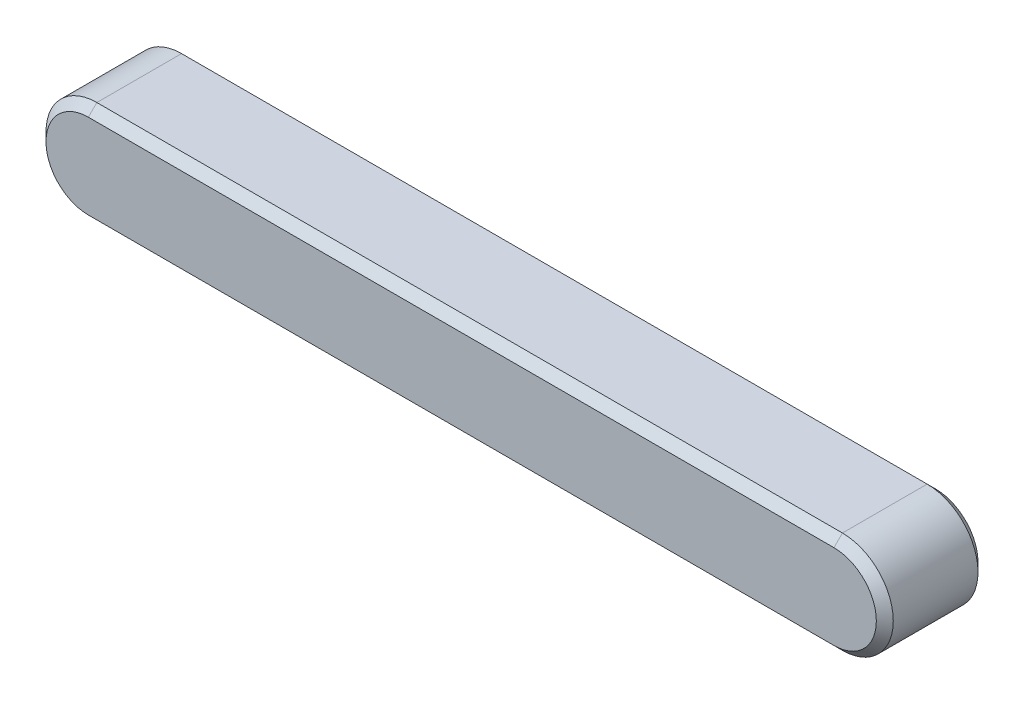
ISO-10303-21;
HEADER;
FILE_DESCRIPTION(('STEP AP214'),'2;1');
FILE_NAME('part.step','',(''),(''),'','','');
FILE_SCHEMA(('AUTOMOTIVE_DESIGN { 1 0 10303 214 1 1 1 1 }'));
ENDSEC;
DATA;
#1=APPLICATION_CONTEXT('core data for automotive mechanical design processes');
#2=APPLICATION_PROTOCOL_DEFINITION('international standard','automotive_design',2000,#1);
#3=PRODUCT_CONTEXT('',#1,'mechanical');
#4=PRODUCT('Part','Part','',(#3));
#5=PRODUCT_RELATED_PRODUCT_CATEGORY('part','',(#4));
#6=PRODUCT_DEFINITION_FORMATION('','',#4);
#7=PRODUCT_DEFINITION_CONTEXT('part definition',#1,'design');
#8=PRODUCT_DEFINITION('design','',#6,#7);
#9=PRODUCT_DEFINITION_SHAPE('','',#8);
#10=(LENGTH_UNIT() NAMED_UNIT(*) SI_UNIT(.MILLI.,.METRE.));
#11=(NAMED_UNIT(*) PLANE_ANGLE_UNIT() SI_UNIT($,.RADIAN.));
#12=(NAMED_UNIT(*) SI_UNIT($,.STERADIAN.) SOLID_ANGLE_UNIT());
#13=UNCERTAINTY_MEASURE_WITH_UNIT(LENGTH_MEASURE(1.E-05),#10,'distance_accuracy_value','');
#14=(GEOMETRIC_REPRESENTATION_CONTEXT(3) GLOBAL_UNCERTAINTY_ASSIGNED_CONTEXT((#13)) GLOBAL_UNIT_ASSIGNED_CONTEXT((#10,
#11,#12)) REPRESENTATION_CONTEXT('',''));
#15=CARTESIAN_POINT('',(0.,0.,0.));
#16=DIRECTION('',(0.,0.,1.));
#17=DIRECTION('',(1.,0.,0.));
#18=AXIS2_PLACEMENT_3D('',#15,#16,#17);
#19=CARTESIAN_POINT('',(-22.,0.,1.5));
#20=DIRECTION('',(0.,0.,-1.));
#21=DIRECTION('',(-1.,0.,0.));
#22=AXIS2_PLACEMENT_3D('',#19,#20,#21);
#23=CYLINDRICAL_SURFACE('',#22,1.5);
#24=DIRECTION('',(0.,0.,-1.));
#25=VECTOR('',#24,1.);
#26=CARTESIAN_POINT('',(-22.,-1.5,1.5));
#27=LINE('',#26,#25);
#28=CARTESIAN_POINT('',(-22.,-1.5,1.25));
#29=VERTEX_POINT('',#28);
#30=CARTESIAN_POINT('',(-22.,-1.5,-1.25));
#31=VERTEX_POINT('',#30);
#32=EDGE_CURVE('E122',#29,#31,#27,.T.);
#33=ORIENTED_EDGE('',*,*,#32,.F.);
#34=CARTESIAN_POINT('',(-22.,0.,1.25));
#35=DIRECTION('',(0.,0.,-1.));
#36=DIRECTION('',(-1.,0.,0.));
#37=AXIS2_PLACEMENT_3D('',#34,#35,#36);
#38=CIRCLE('',#37,1.5);
#39=CARTESIAN_POINT('',(-22.,1.5,1.25));
#40=VERTEX_POINT('',#39);
#41=EDGE_CURVE('E56',#29,#40,#38,.T.);
#42=ORIENTED_EDGE('',*,*,#41,.T.);
#43=DIRECTION('',(0.,0.,-1.));
#44=VECTOR('',#43,1.);
#45=CARTESIAN_POINT('',(-22.,1.5,1.5));
#46=LINE('',#45,#44);
#47=CARTESIAN_POINT('',(-22.,1.5,-1.25));
#48=VERTEX_POINT('',#47);
#49=EDGE_CURVE('E160',#40,#48,#46,.T.);
#50=ORIENTED_EDGE('',*,*,#49,.T.);
#51=CARTESIAN_POINT('',(-22.,0.,-1.25));
#52=DIRECTION('',(0.,0.,-1.));
#53=DIRECTION('',(-1.,0.,0.));
#54=AXIS2_PLACEMENT_3D('',#51,#52,#53);
#55=CIRCLE('',#54,1.5);
#56=EDGE_CURVE('E110',#48,#31,#55,.F.);
#57=ORIENTED_EDGE('',*,*,#56,.T.);
#58=EDGE_LOOP('',(#33,#42,#50,#57));
#59=FACE_BOUND('',#58,.T.);
#60=ADVANCED_FACE('F33',(#59),#23,.T.);
#61=CARTESIAN_POINT('',(0.,-1.5,1.5));
#62=DIRECTION('',(0.,1.,0.));
#63=DIRECTION('',(-1.,0.,0.));
#64=AXIS2_PLACEMENT_3D('',#61,#62,#63);
#65=PLANE('',#64);
#66=ORIENTED_EDGE('',*,*,#32,.T.);
#67=DIRECTION('',(1.,0.,0.));
#68=VECTOR('',#67,1.);
#69=CARTESIAN_POINT('',(0.,-1.5,-1.25));
#70=LINE('',#69,#68);
#71=CARTESIAN_POINT('',(0.,-1.5,-1.25));
#72=VERTEX_POINT('',#71);
#73=EDGE_CURVE('E121',#31,#72,#70,.T.);
#74=ORIENTED_EDGE('',*,*,#73,.T.);
#75=DIRECTION('',(0.,0.,-1.));
#76=VECTOR('',#75,1.);
#77=CARTESIAN_POINT('',(0.,-1.5,1.5));
#78=LINE('',#77,#76);
#79=CARTESIAN_POINT('',(0.,-1.5,1.25));
#80=VERTEX_POINT('',#79);
#81=EDGE_CURVE('E104',#80,#72,#78,.T.);
#82=ORIENTED_EDGE('',*,*,#81,.F.);
#83=DIRECTION('',(-1.,0.,0.));
#84=VECTOR('',#83,1.);
#85=CARTESIAN_POINT('',(0.,-1.5,1.25));
#86=LINE('',#85,#84);
#87=EDGE_CURVE('E119',#80,#29,#86,.T.);
#88=ORIENTED_EDGE('',*,*,#87,.T.);
#89=EDGE_LOOP('',(#66,#74,#82,#88));
#90=FACE_BOUND('',#89,.T.);
#91=ADVANCED_FACE('F118',(#90),#65,.F.);
#92=CARTESIAN_POINT('',(0.,0.,1.5));
#93=DIRECTION('',(0.,0.,-1.));
#94=DIRECTION('',(-1.,0.,0.));
#95=AXIS2_PLACEMENT_3D('',#92,#93,#94);
#96=CYLINDRICAL_SURFACE('',#95,1.5);
#97=DIRECTION('',(0.,0.,-1.));
#98=VECTOR('',#97,1.);
#99=CARTESIAN_POINT('',(0.,1.5,1.5));
#100=LINE('',#99,#98);
#101=CARTESIAN_POINT('',(0.,1.5,1.25));
#102=VERTEX_POINT('',#101);
#103=CARTESIAN_POINT('',(0.,1.5,-1.25));
#104=VERTEX_POINT('',#103);
#105=EDGE_CURVE('E105',#102,#104,#100,.T.);
#106=ORIENTED_EDGE('',*,*,#105,.F.);
#107=CARTESIAN_POINT('',(0.,0.,1.25));
#108=DIRECTION('',(0.,0.,-1.));
#109=DIRECTION('',(-1.,0.,0.));
#110=AXIS2_PLACEMENT_3D('',#107,#108,#109);
#111=CIRCLE('',#110,1.5);
#112=EDGE_CURVE('E101',#102,#80,#111,.T.);
#113=ORIENTED_EDGE('',*,*,#112,.T.);
#114=ORIENTED_EDGE('',*,*,#81,.T.);
#115=CARTESIAN_POINT('',(0.,0.,-1.25));
#116=DIRECTION('',(0.,0.,-1.));
#117=DIRECTION('',(-1.,0.,0.));
#118=AXIS2_PLACEMENT_3D('',#115,#116,#117);
#119=CIRCLE('',#118,1.5);
#120=EDGE_CURVE('E111',#72,#104,#119,.F.);
#121=ORIENTED_EDGE('',*,*,#120,.T.);
#122=EDGE_LOOP('',(#106,#113,#114,#121));
#123=FACE_BOUND('',#122,.T.);
#124=ADVANCED_FACE('F103',(#123),#96,.T.);
#125=CARTESIAN_POINT('',(-22.,1.5,1.5));
#126=DIRECTION('',(0.,-1.,0.));
#127=DIRECTION('',(1.,0.,0.));
#128=AXIS2_PLACEMENT_3D('',#125,#126,#127);
#129=PLANE('',#128);
#130=ORIENTED_EDGE('',*,*,#49,.F.);
#131=DIRECTION('',(1.,0.,0.));
#132=VECTOR('',#131,1.);
#133=CARTESIAN_POINT('',(-22.,1.5,1.25));
#134=LINE('',#133,#132);
#135=EDGE_CURVE('E11',#40,#102,#134,.T.);
#136=ORIENTED_EDGE('',*,*,#135,.T.);
#137=ORIENTED_EDGE('',*,*,#105,.T.);
#138=DIRECTION('',(-1.,0.,0.));
#139=VECTOR('',#138,1.);
#140=CARTESIAN_POINT('',(-22.,1.5,-1.25));
#141=LINE('',#140,#139);
#142=EDGE_CURVE('E42',#104,#48,#141,.T.);
#143=ORIENTED_EDGE('',*,*,#142,.T.);
#144=EDGE_LOOP('',(#130,#136,#137,#143));
#145=FACE_BOUND('',#144,.T.);
#146=ADVANCED_FACE('F210',(#145),#129,.F.);
#147=CARTESIAN_POINT('',(-22.,0.,1.5));
#148=DIRECTION('',(0.,0.,-1.));
#149=DIRECTION('',(-1.,0.,0.));
#150=AXIS2_PLACEMENT_3D('',#147,#148,#149);
#151=PLANE('',#150);
#152=CARTESIAN_POINT('',(-22.,0.,1.5));
#153=DIRECTION('',(0.,0.,-1.));
#154=DIRECTION('',(-1.,0.,0.));
#155=AXIS2_PLACEMENT_3D('',#152,#153,#154);
#156=CIRCLE('',#155,1.25);
#157=CARTESIAN_POINT('',(-22.,1.25,1.5));
#158=VERTEX_POINT('',#157);
#159=CARTESIAN_POINT('',(-22.,-1.25,1.5));
#160=VERTEX_POINT('',#159);
#161=EDGE_CURVE('E181',#158,#160,#156,.F.);
#162=ORIENTED_EDGE('',*,*,#161,.T.);
#163=DIRECTION('',(1.,0.,0.));
#164=VECTOR('',#163,1.);
#165=CARTESIAN_POINT('',(-22.,-1.25,1.5));
#166=LINE('',#165,#164);
#167=CARTESIAN_POINT('',(0.,-1.25,1.5));
#168=VERTEX_POINT('',#167);
#169=EDGE_CURVE('E184',#160,#168,#166,.T.);
#170=ORIENTED_EDGE('',*,*,#169,.T.);
#171=CARTESIAN_POINT('',(0.,0.,1.5));
#172=DIRECTION('',(0.,0.,-1.));
#173=DIRECTION('',(-1.,0.,0.));
#174=AXIS2_PLACEMENT_3D('',#171,#172,#173);
#175=CIRCLE('',#174,1.25);
#176=CARTESIAN_POINT('',(0.,1.25,1.5));
#177=VERTEX_POINT('',#176);
#178=EDGE_CURVE('E133',#168,#177,#175,.F.);
#179=ORIENTED_EDGE('',*,*,#178,.T.);
#180=DIRECTION('',(-1.,0.,0.));
#181=VECTOR('',#180,1.);
#182=CARTESIAN_POINT('',(-22.,1.25,1.5));
#183=LINE('',#182,#181);
#184=EDGE_CURVE('E179',#177,#158,#183,.T.);
#185=ORIENTED_EDGE('',*,*,#184,.T.);
#186=EDGE_LOOP('',(#162,#170,#179,#185));
#187=FACE_BOUND('',#186,.T.);
#188=ADVANCED_FACE('F213',(#187),#151,.F.);
#189=CARTESIAN_POINT('',(-22.,0.,-1.5));
#190=DIRECTION('',(0.,0.,-1.));
#191=DIRECTION('',(-1.,0.,0.));
#192=AXIS2_PLACEMENT_3D('',#189,#190,#191);
#193=PLANE('',#192);
#194=CARTESIAN_POINT('',(0.,0.,-1.5));
#195=DIRECTION('',(0.,0.,-1.));
#196=DIRECTION('',(-1.,0.,0.));
#197=AXIS2_PLACEMENT_3D('',#194,#195,#196);
#198=CIRCLE('',#197,1.25);
#199=CARTESIAN_POINT('',(0.,1.25,-1.5));
#200=VERTEX_POINT('',#199);
#201=CARTESIAN_POINT('',(0.,-1.25,-1.5));
#202=VERTEX_POINT('',#201);
#203=EDGE_CURVE('E174',#200,#202,#198,.T.);
#204=ORIENTED_EDGE('',*,*,#203,.T.);
#205=DIRECTION('',(-1.,0.,0.));
#206=VECTOR('',#205,1.);
#207=CARTESIAN_POINT('',(-22.,-1.25,-1.5));
#208=LINE('',#207,#206);
#209=CARTESIAN_POINT('',(-22.,-1.25,-1.5));
#210=VERTEX_POINT('',#209);
#211=EDGE_CURVE('E176',#202,#210,#208,.T.);
#212=ORIENTED_EDGE('',*,*,#211,.T.);
#213=CARTESIAN_POINT('',(-22.,0.,-1.5));
#214=DIRECTION('',(0.,0.,-1.));
#215=DIRECTION('',(-1.,0.,0.));
#216=AXIS2_PLACEMENT_3D('',#213,#214,#215);
#217=CIRCLE('',#216,1.25);
#218=CARTESIAN_POINT('',(-22.,1.25,-1.5));
#219=VERTEX_POINT('',#218);
#220=EDGE_CURVE('E172',#210,#219,#217,.T.);
#221=ORIENTED_EDGE('',*,*,#220,.T.);
#222=DIRECTION('',(1.,0.,0.));
#223=VECTOR('',#222,1.);
#224=CARTESIAN_POINT('',(0.,1.25,-1.5));
#225=LINE('',#224,#223);
#226=EDGE_CURVE('E170',#219,#200,#225,.T.);
#227=ORIENTED_EDGE('',*,*,#226,.T.);
#228=EDGE_LOOP('',(#204,#212,#221,#227));
#229=FACE_BOUND('',#228,.T.);
#230=ADVANCED_FACE('F214',(#229),#193,.T.);
#231=CARTESIAN_POINT('',(-22.,1.5,-1.25));
#232=DIRECTION('',(0.,0.707106781186547,-0.707106781186547));
#233=DIRECTION('',(0.,0.707106781186548,0.707106781186548));
#234=AXIS2_PLACEMENT_3D('',#231,#232,#233);
#235=PLANE('',#234);
#236=DIRECTION('',(0.,0.707106781186547,0.707106781186547));
#237=VECTOR('',#236,1.);
#238=CARTESIAN_POINT('',(0.,1.25,-1.5));
#239=LINE('',#238,#237);
#240=EDGE_CURVE('E152',#200,#104,#239,.T.);
#241=ORIENTED_EDGE('',*,*,#240,.F.);
#242=ORIENTED_EDGE('',*,*,#226,.F.);
#243=DIRECTION('',(0.,-0.707106781186547,-0.707106781186547));
#244=VECTOR('',#243,1.);
#245=CARTESIAN_POINT('',(-22.,1.5,-1.25));
#246=LINE('',#245,#244);
#247=EDGE_CURVE('E139',#48,#219,#246,.T.);
#248=ORIENTED_EDGE('',*,*,#247,.F.);
#249=ORIENTED_EDGE('',*,*,#142,.F.);
#250=EDGE_LOOP('',(#241,#242,#248,#249));
#251=FACE_BOUND('',#250,.T.);
#252=ADVANCED_FACE('F217',(#251),#235,.T.);
#253=CARTESIAN_POINT('',(-22.,0.,-1.25));
#254=DIRECTION('',(0.,0.,1.));
#255=DIRECTION('',(1.,0.,0.));
#256=AXIS2_PLACEMENT_3D('',#253,#254,#255);
#257=CONICAL_SURFACE('',#256,1.5,0.785398163397448);
#258=ORIENTED_EDGE('',*,*,#247,.T.);
#259=ORIENTED_EDGE('',*,*,#220,.F.);
#260=DIRECTION('',(0.,0.707106781186547,-0.707106781186547));
#261=VECTOR('',#260,1.);
#262=CARTESIAN_POINT('',(-22.,-1.5,-1.25));
#263=LINE('',#262,#261);
#264=EDGE_CURVE('E146',#31,#210,#263,.T.);
#265=ORIENTED_EDGE('',*,*,#264,.F.);
#266=ORIENTED_EDGE('',*,*,#56,.F.);
#267=EDGE_LOOP('',(#258,#259,#265,#266));
#268=FACE_BOUND('',#267,.T.);
#269=ADVANCED_FACE('F189',(#268),#257,.T.);
#270=CARTESIAN_POINT('',(0.,0.,-1.25));
#271=DIRECTION('',(0.,0.,1.));
#272=DIRECTION('',(1.,0.,0.));
#273=AXIS2_PLACEMENT_3D('',#270,#271,#272);
#274=CONICAL_SURFACE('',#273,1.5,0.785398163397448);
#275=ORIENTED_EDGE('',*,*,#240,.T.);
#276=ORIENTED_EDGE('',*,*,#120,.F.);
#277=DIRECTION('',(0.,-0.707106781186547,0.707106781186547));
#278=VECTOR('',#277,1.);
#279=CARTESIAN_POINT('',(0.,-1.25,-1.5));
#280=LINE('',#279,#278);
#281=EDGE_CURVE('E142',#202,#72,#280,.T.);
#282=ORIENTED_EDGE('',*,*,#281,.F.);
#283=ORIENTED_EDGE('',*,*,#203,.F.);
#284=EDGE_LOOP('',(#275,#276,#282,#283));
#285=FACE_BOUND('',#284,.T.);
#286=ADVANCED_FACE('F192',(#285),#274,.T.);
#287=CARTESIAN_POINT('',(0.,-1.5,-1.25));
#288=DIRECTION('',(0.,-0.707106781186547,-0.707106781186547));
#289=DIRECTION('',(0.,0.707106781186548,-0.707106781186548));
#290=AXIS2_PLACEMENT_3D('',#287,#288,#289);
#291=PLANE('',#290);
#292=ORIENTED_EDGE('',*,*,#264,.T.);
#293=ORIENTED_EDGE('',*,*,#211,.F.);
#294=ORIENTED_EDGE('',*,*,#281,.T.);
#295=ORIENTED_EDGE('',*,*,#73,.F.);
#296=EDGE_LOOP('',(#292,#293,#294,#295));
#297=FACE_BOUND('',#296,.T.);
#298=ADVANCED_FACE('F190',(#297),#291,.T.);
#299=CARTESIAN_POINT('',(-22.,1.25,1.5));
#300=DIRECTION('',(0.,-0.707106781186547,-0.707106781186547));
#301=DIRECTION('',(0.,0.707106781186548,-0.707106781186548));
#302=AXIS2_PLACEMENT_3D('',#299,#300,#301);
#303=PLANE('',#302);
#304=DIRECTION('',(0.,-0.707106781186547,0.707106781186547));
#305=VECTOR('',#304,1.);
#306=CARTESIAN_POINT('',(0.,1.5,1.25));
#307=LINE('',#306,#305);
#308=EDGE_CURVE('E136',#102,#177,#307,.T.);
#309=ORIENTED_EDGE('',*,*,#308,.F.);
#310=ORIENTED_EDGE('',*,*,#135,.F.);
#311=DIRECTION('',(0.,0.707106781186547,-0.707106781186547));
#312=VECTOR('',#311,1.);
#313=CARTESIAN_POINT('',(-22.,1.25,1.5));
#314=LINE('',#313,#312);
#315=EDGE_CURVE('E37',#158,#40,#314,.T.);
#316=ORIENTED_EDGE('',*,*,#315,.F.);
#317=ORIENTED_EDGE('',*,*,#184,.F.);
#318=EDGE_LOOP('',(#309,#310,#316,#317));
#319=FACE_BOUND('',#318,.T.);
#320=ADVANCED_FACE('F35',(#319),#303,.F.);
#321=CARTESIAN_POINT('',(-22.,0.,1.5));
#322=DIRECTION('',(0.,0.,-1.));
#323=DIRECTION('',(-1.,0.,0.));
#324=AXIS2_PLACEMENT_3D('',#321,#322,#323);
#325=CONICAL_SURFACE('',#324,1.25,0.785398163397448);
#326=ORIENTED_EDGE('',*,*,#315,.T.);
#327=ORIENTED_EDGE('',*,*,#41,.F.);
#328=DIRECTION('',(0.,-0.707106781186547,-0.707106781186547));
#329=VECTOR('',#328,1.);
#330=CARTESIAN_POINT('',(-22.,-1.25,1.5));
#331=LINE('',#330,#329);
#332=EDGE_CURVE('E130',#160,#29,#331,.T.);
#333=ORIENTED_EDGE('',*,*,#332,.F.);
#334=ORIENTED_EDGE('',*,*,#161,.F.);
#335=EDGE_LOOP('',(#326,#327,#333,#334));
#336=FACE_BOUND('',#335,.T.);
#337=ADVANCED_FACE('F198',(#336),#325,.T.);
#338=CARTESIAN_POINT('',(0.,0.,1.5));
#339=DIRECTION('',(0.,0.,-1.));
#340=DIRECTION('',(-1.,0.,0.));
#341=AXIS2_PLACEMENT_3D('',#338,#339,#340);
#342=CONICAL_SURFACE('',#341,1.25,0.785398163397448);
#343=ORIENTED_EDGE('',*,*,#308,.T.);
#344=ORIENTED_EDGE('',*,*,#178,.F.);
#345=DIRECTION('',(0.,0.707106781186547,0.707106781186547));
#346=VECTOR('',#345,1.);
#347=CARTESIAN_POINT('',(0.,-1.5,1.25));
#348=LINE('',#347,#346);
#349=EDGE_CURVE('E127',#80,#168,#348,.T.);
#350=ORIENTED_EDGE('',*,*,#349,.F.);
#351=ORIENTED_EDGE('',*,*,#112,.F.);
#352=EDGE_LOOP('',(#343,#344,#350,#351));
#353=FACE_BOUND('',#352,.T.);
#354=ADVANCED_FACE('F132',(#353),#342,.T.);
#355=CARTESIAN_POINT('',(-22.,-1.25,1.5));
#356=DIRECTION('',(0.,0.707106781186547,-0.707106781186547));
#357=DIRECTION('',(0.,0.707106781186548,0.707106781186548));
#358=AXIS2_PLACEMENT_3D('',#355,#356,#357);
#359=PLANE('',#358);
#360=ORIENTED_EDGE('',*,*,#332,.T.);
#361=ORIENTED_EDGE('',*,*,#87,.F.);
#362=ORIENTED_EDGE('',*,*,#349,.T.);
#363=ORIENTED_EDGE('',*,*,#169,.F.);
#364=EDGE_LOOP('',(#360,#361,#362,#363));
#365=FACE_BOUND('',#364,.T.);
#366=ADVANCED_FACE('F125',(#365),#359,.F.);
#367=CLOSED_SHELL('',(#60,#91,#124,#146,#188,#230,#252,#269,#286,#298,#320,#337,#354,#366));
#368=MANIFOLD_SOLID_BREP('B2',#367);
#369=ADVANCED_BREP_SHAPE_REPRESENTATION('',(#18,#368),#14);
#370=SHAPE_DEFINITION_REPRESENTATION(#9,#369);
ENDSEC;
END-ISO-10303-21;
